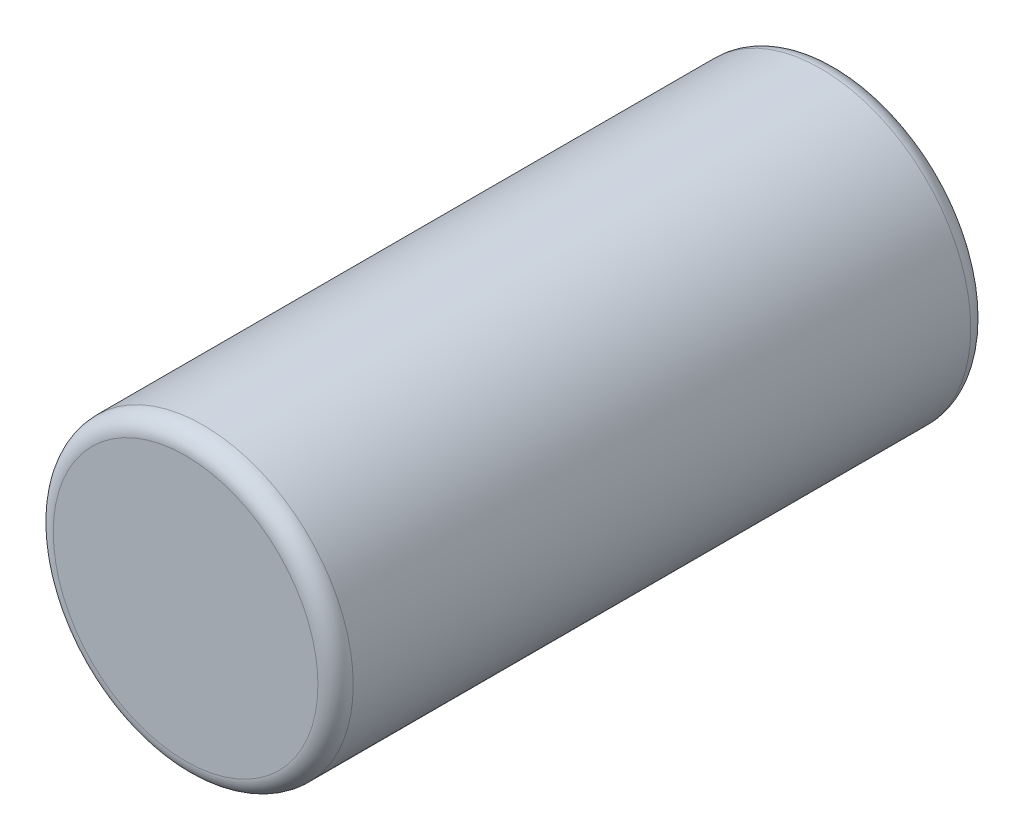
ISO-10303-21;
HEADER;
FILE_DESCRIPTION(('STEP AP214'),'2;1');
FILE_NAME('part.step','',(''),(''),'','','');
FILE_SCHEMA(('AUTOMOTIVE_DESIGN { 1 0 10303 214 1 1 1 1 }'));
ENDSEC;
DATA;
#1=APPLICATION_CONTEXT('core data for automotive mechanical design processes');
#2=APPLICATION_PROTOCOL_DEFINITION('international standard','automotive_design',2000,#1);
#3=PRODUCT_CONTEXT('',#1,'mechanical');
#4=PRODUCT('Part','Part','',(#3));
#5=PRODUCT_RELATED_PRODUCT_CATEGORY('part','',(#4));
#6=PRODUCT_DEFINITION_FORMATION('','',#4);
#7=PRODUCT_DEFINITION_CONTEXT('part definition',#1,'design');
#8=PRODUCT_DEFINITION('design','',#6,#7);
#9=PRODUCT_DEFINITION_SHAPE('','',#8);
#10=(LENGTH_UNIT() NAMED_UNIT(*) SI_UNIT(.MILLI.,.METRE.));
#11=(NAMED_UNIT(*) PLANE_ANGLE_UNIT() SI_UNIT($,.RADIAN.));
#12=(NAMED_UNIT(*) SI_UNIT($,.STERADIAN.) SOLID_ANGLE_UNIT());
#13=UNCERTAINTY_MEASURE_WITH_UNIT(LENGTH_MEASURE(1.E-05),#10,'distance_accuracy_value','');
#14=(GEOMETRIC_REPRESENTATION_CONTEXT(3) GLOBAL_UNCERTAINTY_ASSIGNED_CONTEXT((#13)) GLOBAL_UNIT_ASSIGNED_CONTEXT((#10,
#11,#12)) REPRESENTATION_CONTEXT('',''));
#15=CARTESIAN_POINT('',(0.,0.,0.));
#16=DIRECTION('',(0.,0.,1.));
#17=DIRECTION('',(1.,0.,0.));
#18=AXIS2_PLACEMENT_3D('',#15,#16,#17);
#19=CARTESIAN_POINT('',(0.,0.,37.));
#20=DIRECTION('',(0.,0.,-1.));
#21=DIRECTION('',(-1.,0.,0.));
#22=AXIS2_PLACEMENT_3D('',#19,#20,#21);
#23=CYLINDRICAL_SURFACE('',#22,8.5);
#24=CARTESIAN_POINT('',(0.,0.,1.));
#25=DIRECTION('',(0.,0.,1.));
#26=DIRECTION('',(1.,0.,0.));
#27=AXIS2_PLACEMENT_3D('',#24,#25,#26);
#28=CIRCLE('',#27,8.5);
#29=CARTESIAN_POINT('',(8.5,0.,1.));
#30=VERTEX_POINT('',#29);
#31=EDGE_CURVE('E44',#30,#30,#28,.T.);
#32=ORIENTED_EDGE('',*,*,#31,.T.);
#33=EDGE_LOOP('',(#32));
#34=FACE_BOUND('',#33,.T.);
#35=CARTESIAN_POINT('',(0.,0.,36.));
#36=DIRECTION('',(0.,0.,1.));
#37=DIRECTION('',(1.,0.,0.));
#38=AXIS2_PLACEMENT_3D('',#35,#36,#37);
#39=CIRCLE('',#38,8.5);
#40=CARTESIAN_POINT('',(8.5,0.,36.));
#41=VERTEX_POINT('',#40);
#42=EDGE_CURVE('E48',#41,#41,#39,.F.);
#43=ORIENTED_EDGE('',*,*,#42,.T.);
#44=EDGE_LOOP('',(#43));
#45=FACE_BOUND('',#44,.T.);
#46=ADVANCED_FACE('F33',(#34,#45),#23,.T.);
#47=CARTESIAN_POINT('',(0.,0.,37.));
#48=DIRECTION('',(0.,0.,1.));
#49=DIRECTION('',(1.,0.,0.));
#50=AXIS2_PLACEMENT_3D('',#47,#48,#49);
#51=PLANE('',#50);
#52=CARTESIAN_POINT('',(0.,0.,37.));
#53=DIRECTION('',(0.,0.,1.));
#54=DIRECTION('',(1.,0.,0.));
#55=AXIS2_PLACEMENT_3D('',#52,#53,#54);
#56=CIRCLE('',#55,7.5);
#57=CARTESIAN_POINT('',(7.5,0.,37.));
#58=VERTEX_POINT('',#57);
#59=EDGE_CURVE('E10',#58,#58,#56,.T.);
#60=ORIENTED_EDGE('',*,*,#59,.T.);
#61=EDGE_LOOP('',(#60));
#62=FACE_BOUND('',#61,.T.);
#63=ADVANCED_FACE('F64',(#62),#51,.T.);
#64=CARTESIAN_POINT('',(0.,0.,0.));
#65=DIRECTION('',(0.,0.,1.));
#66=DIRECTION('',(1.,0.,0.));
#67=AXIS2_PLACEMENT_3D('',#64,#65,#66);
#68=PLANE('',#67);
#69=CARTESIAN_POINT('',(0.,0.,0.));
#70=DIRECTION('',(0.,0.,1.));
#71=DIRECTION('',(1.,0.,0.));
#72=AXIS2_PLACEMENT_3D('',#69,#70,#71);
#73=CIRCLE('',#72,7.5);
#74=CARTESIAN_POINT('',(7.5,0.,0.));
#75=VERTEX_POINT('',#74);
#76=EDGE_CURVE('E40',#75,#75,#73,.F.);
#77=ORIENTED_EDGE('',*,*,#76,.T.);
#78=EDGE_LOOP('',(#77));
#79=FACE_BOUND('',#78,.T.);
#80=ADVANCED_FACE('F61',(#79),#68,.F.);
#81=CARTESIAN_POINT('',(0.,0.,1.));
#82=DIRECTION('',(0.,0.,1.));
#83=DIRECTION('',(1.,0.,0.));
#84=AXIS2_PLACEMENT_3D('',#81,#82,#83);
#85=TOROIDAL_SURFACE('',#84,7.5,1.);
#86=ORIENTED_EDGE('',*,*,#76,.F.);
#87=EDGE_LOOP('',(#86));
#88=FACE_BOUND('',#87,.T.);
#89=ORIENTED_EDGE('',*,*,#31,.F.);
#90=EDGE_LOOP('',(#89));
#91=FACE_BOUND('',#90,.T.);
#92=ADVANCED_FACE('F57',(#88,#91),#85,.T.);
#93=CARTESIAN_POINT('',(0.,0.,36.));
#94=DIRECTION('',(0.,0.,1.));
#95=DIRECTION('',(1.,0.,0.));
#96=AXIS2_PLACEMENT_3D('',#93,#94,#95);
#97=TOROIDAL_SURFACE('',#96,7.5,1.);
#98=ORIENTED_EDGE('',*,*,#42,.F.);
#99=EDGE_LOOP('',(#98));
#100=FACE_BOUND('',#99,.T.);
#101=ORIENTED_EDGE('',*,*,#59,.F.);
#102=EDGE_LOOP('',(#101));
#103=FACE_BOUND('',#102,.T.);
#104=ADVANCED_FACE('F35',(#100,#103),#97,.T.);
#105=CLOSED_SHELL('',(#46,#63,#80,#92,#104));
#106=MANIFOLD_SOLID_BREP('B2',#105);
#107=ADVANCED_BREP_SHAPE_REPRESENTATION('',(#18,#106),#14);
#108=SHAPE_DEFINITION_REPRESENTATION(#9,#107);
ENDSEC;
END-ISO-10303-21;
